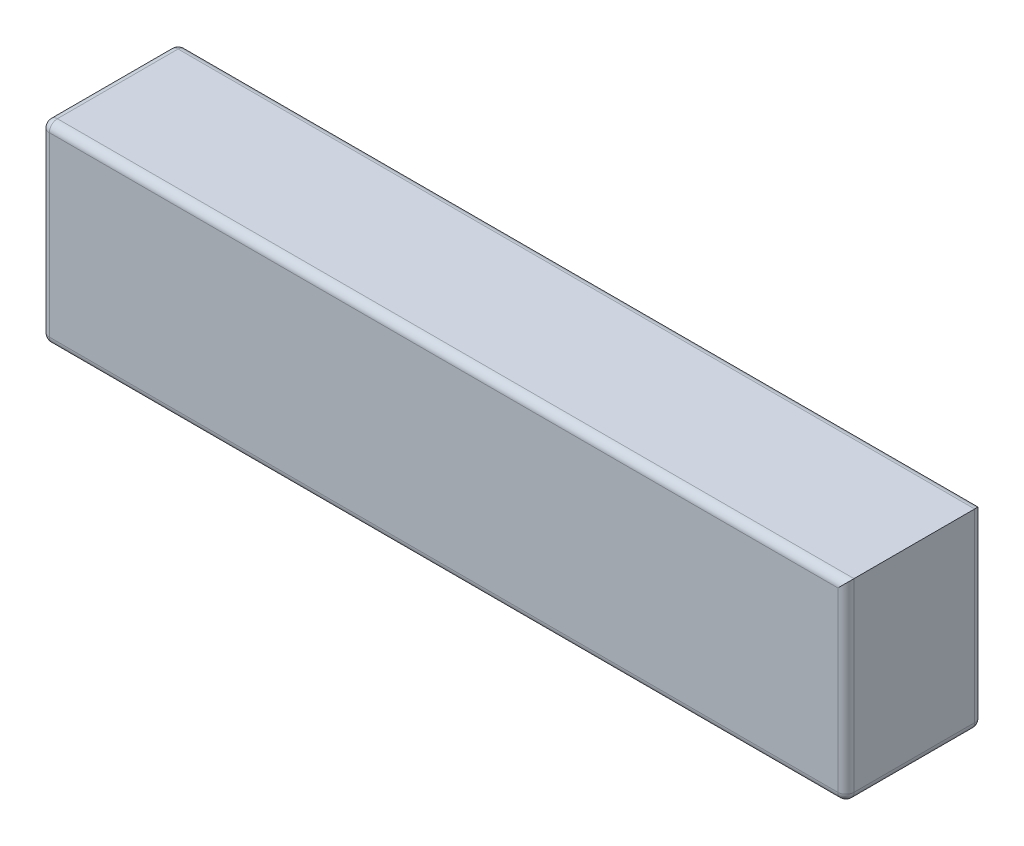
ISO-10303-21;
HEADER;
FILE_DESCRIPTION(('STEP AP214'),'2;1');
FILE_NAME('part.step','',(''),(''),'','','');
FILE_SCHEMA(('AUTOMOTIVE_DESIGN { 1 0 10303 214 1 1 1 1 }'));
ENDSEC;
DATA;
#1=APPLICATION_CONTEXT('core data for automotive mechanical design processes');
#2=APPLICATION_PROTOCOL_DEFINITION('international standard','automotive_design',2000,#1);
#3=PRODUCT_CONTEXT('',#1,'mechanical');
#4=PRODUCT('Part','Part','',(#3));
#5=PRODUCT_RELATED_PRODUCT_CATEGORY('part','',(#4));
#6=PRODUCT_DEFINITION_FORMATION('','',#4);
#7=PRODUCT_DEFINITION_CONTEXT('part definition',#1,'design');
#8=PRODUCT_DEFINITION('design','',#6,#7);
#9=PRODUCT_DEFINITION_SHAPE('','',#8);
#10=(LENGTH_UNIT() NAMED_UNIT(*) SI_UNIT(.MILLI.,.METRE.));
#11=(NAMED_UNIT(*) PLANE_ANGLE_UNIT() SI_UNIT($,.RADIAN.));
#12=(NAMED_UNIT(*) SI_UNIT($,.STERADIAN.) SOLID_ANGLE_UNIT());
#13=UNCERTAINTY_MEASURE_WITH_UNIT(LENGTH_MEASURE(1.E-05),#10,'distance_accuracy_value','');
#14=(GEOMETRIC_REPRESENTATION_CONTEXT(3) GLOBAL_UNCERTAINTY_ASSIGNED_CONTEXT((#13)) GLOBAL_UNIT_ASSIGNED_CONTEXT((#10,
#11,#12)) REPRESENTATION_CONTEXT('',''));
#15=CARTESIAN_POINT('',(0.,0.,0.));
#16=DIRECTION('',(0.,0.,1.));
#17=DIRECTION('',(1.,0.,0.));
#18=AXIS2_PLACEMENT_3D('',#15,#16,#17);
#19=CARTESIAN_POINT('',(12.7,3.048,4.318));
#20=DIRECTION('',(-1.,0.,0.));
#21=DIRECTION('',(0.,-1.,0.));
#22=AXIS2_PLACEMENT_3D('',#19,#20,#21);
#23=PLANE('',#22);
#24=DIRECTION('',(0.,0.,-1.));
#25=VECTOR('',#24,1.);
#26=CARTESIAN_POINT('',(12.7,-2.794,4.318));
#27=LINE('',#26,#25);
#28=CARTESIAN_POINT('',(12.7,-2.794,4.064));
#29=VERTEX_POINT('',#28);
#30=CARTESIAN_POINT('',(12.7,-2.794,0.254));
#31=VERTEX_POINT('',#30);
#32=EDGE_CURVE('E52',#29,#31,#27,.T.);
#33=ORIENTED_EDGE('',*,*,#32,.T.);
#34=DIRECTION('',(0.,1.,0.));
#35=VECTOR('',#34,1.);
#36=CARTESIAN_POINT('',(12.7,3.048,0.254));
#37=LINE('',#36,#35);
#38=CARTESIAN_POINT('',(12.7,3.048,0.254));
#39=VERTEX_POINT('',#38);
#40=EDGE_CURVE('E11',#31,#39,#37,.T.);
#41=ORIENTED_EDGE('',*,*,#40,.T.);
#42=DIRECTION('',(0.,0.,-1.));
#43=VECTOR('',#42,1.);
#44=CARTESIAN_POINT('',(12.7,3.048,4.318));
#45=LINE('',#44,#43);
#46=CARTESIAN_POINT('',(12.7,3.048,4.064));
#47=VERTEX_POINT('',#46);
#48=EDGE_CURVE('E158',#47,#39,#45,.T.);
#49=ORIENTED_EDGE('',*,*,#48,.F.);
#50=DIRECTION('',(0.,1.,0.));
#51=VECTOR('',#50,1.);
#52=CARTESIAN_POINT('',(12.7,-3.048,4.064));
#53=LINE('',#52,#51);
#54=EDGE_CURVE('E63',#47,#29,#53,.F.);
#55=ORIENTED_EDGE('',*,*,#54,.T.);
#56=EDGE_LOOP('',(#33,#41,#49,#55));
#57=FACE_BOUND('',#56,.T.);
#58=ADVANCED_FACE('F42',(#57),#23,.F.);
#59=CARTESIAN_POINT('',(-12.7,3.048,4.318));
#60=DIRECTION('',(0.,-1.,0.));
#61=DIRECTION('',(0.,0.,-1.));
#62=AXIS2_PLACEMENT_3D('',#59,#60,#61);
#63=PLANE('',#62);
#64=ORIENTED_EDGE('',*,*,#48,.T.);
#65=DIRECTION('',(-1.,0.,0.));
#66=VECTOR('',#65,1.);
#67=CARTESIAN_POINT('',(-12.7,3.048,0.254));
#68=LINE('',#67,#66);
#69=CARTESIAN_POINT('',(-12.446,3.048,0.254));
#70=VERTEX_POINT('',#69);
#71=EDGE_CURVE('E175',#39,#70,#68,.T.);
#72=ORIENTED_EDGE('',*,*,#71,.T.);
#73=DIRECTION('',(0.,0.,-1.));
#74=VECTOR('',#73,1.);
#75=CARTESIAN_POINT('',(-12.446,3.048,4.318));
#76=LINE('',#75,#74);
#77=CARTESIAN_POINT('',(-12.446,3.048,4.064));
#78=VERTEX_POINT('',#77);
#79=EDGE_CURVE('E132',#70,#78,#76,.F.);
#80=ORIENTED_EDGE('',*,*,#79,.T.);
#81=DIRECTION('',(-1.,0.,0.));
#82=VECTOR('',#81,1.);
#83=CARTESIAN_POINT('',(12.7,3.048,4.064));
#84=LINE('',#83,#82);
#85=EDGE_CURVE('E165',#78,#47,#84,.F.);
#86=ORIENTED_EDGE('',*,*,#85,.T.);
#87=EDGE_LOOP('',(#64,#72,#80,#86));
#88=FACE_BOUND('',#87,.T.);
#89=ADVANCED_FACE('F314',(#88),#63,.F.);
#90=CARTESIAN_POINT('',(-12.7,3.048,4.318));
#91=DIRECTION('',(1.,0.,0.));
#92=DIRECTION('',(0.,0.,-1.));
#93=AXIS2_PLACEMENT_3D('',#90,#91,#92);
#94=PLANE('',#93);
#95=DIRECTION('',(0.,-1.,0.));
#96=VECTOR('',#95,1.);
#97=CARTESIAN_POINT('',(-12.7,3.048,4.064));
#98=LINE('',#97,#96);
#99=CARTESIAN_POINT('',(-12.7,-2.794,4.064));
#100=VERTEX_POINT('',#99);
#101=CARTESIAN_POINT('',(-12.7,2.794,4.064));
#102=VERTEX_POINT('',#101);
#103=EDGE_CURVE('E162',#100,#102,#98,.F.);
#104=ORIENTED_EDGE('',*,*,#103,.T.);
#105=DIRECTION('',(0.,0.,-1.));
#106=VECTOR('',#105,1.);
#107=CARTESIAN_POINT('',(-12.7,2.794,4.318));
#108=LINE('',#107,#106);
#109=CARTESIAN_POINT('',(-12.7,2.794,0.254));
#110=VERTEX_POINT('',#109);
#111=EDGE_CURVE('E130',#102,#110,#108,.T.);
#112=ORIENTED_EDGE('',*,*,#111,.T.);
#113=DIRECTION('',(0.,-1.,0.));
#114=VECTOR('',#113,1.);
#115=CARTESIAN_POINT('',(-12.7,3.048,0.254));
#116=LINE('',#115,#114);
#117=CARTESIAN_POINT('',(-12.7,-2.794,0.254));
#118=VERTEX_POINT('',#117);
#119=EDGE_CURVE('E150',#110,#118,#116,.T.);
#120=ORIENTED_EDGE('',*,*,#119,.T.);
#121=DIRECTION('',(0.,0.,-1.));
#122=VECTOR('',#121,1.);
#123=CARTESIAN_POINT('',(-12.7,-2.794,4.318));
#124=LINE('',#123,#122);
#125=EDGE_CURVE('E157',#118,#100,#124,.F.);
#126=ORIENTED_EDGE('',*,*,#125,.T.);
#127=EDGE_LOOP('',(#104,#112,#120,#126));
#128=FACE_BOUND('',#127,.T.);
#129=ADVANCED_FACE('F160',(#128),#94,.F.);
#130=CARTESIAN_POINT('',(-12.7,-3.048,4.318));
#131=DIRECTION('',(0.,1.,0.));
#132=DIRECTION('',(0.,0.,1.));
#133=AXIS2_PLACEMENT_3D('',#130,#131,#132);
#134=PLANE('',#133);
#135=DIRECTION('',(1.,0.,0.));
#136=VECTOR('',#135,1.);
#137=CARTESIAN_POINT('',(-12.7,-3.048,4.064));
#138=LINE('',#137,#136);
#139=CARTESIAN_POINT('',(12.446,-3.048,4.064));
#140=VERTEX_POINT('',#139);
#141=CARTESIAN_POINT('',(-12.446,-3.048,4.064));
#142=VERTEX_POINT('',#141);
#143=EDGE_CURVE('E191',#140,#142,#138,.F.);
#144=ORIENTED_EDGE('',*,*,#143,.T.);
#145=DIRECTION('',(0.,0.,-1.));
#146=VECTOR('',#145,1.);
#147=CARTESIAN_POINT('',(-12.446,-3.048,4.318));
#148=LINE('',#147,#146);
#149=CARTESIAN_POINT('',(-12.446,-3.048,0.254));
#150=VERTEX_POINT('',#149);
#151=EDGE_CURVE('E200',#142,#150,#148,.T.);
#152=ORIENTED_EDGE('',*,*,#151,.T.);
#153=DIRECTION('',(1.,0.,0.));
#154=VECTOR('',#153,1.);
#155=CARTESIAN_POINT('',(-12.7,-3.048,0.254));
#156=LINE('',#155,#154);
#157=CARTESIAN_POINT('',(12.446,-3.048,0.254));
#158=VERTEX_POINT('',#157);
#159=EDGE_CURVE('E197',#150,#158,#156,.T.);
#160=ORIENTED_EDGE('',*,*,#159,.T.);
#161=DIRECTION('',(0.,0.,-1.));
#162=VECTOR('',#161,1.);
#163=CARTESIAN_POINT('',(12.446,-3.048,4.318));
#164=LINE('',#163,#162);
#165=EDGE_CURVE('E194',#158,#140,#164,.F.);
#166=ORIENTED_EDGE('',*,*,#165,.T.);
#167=EDGE_LOOP('',(#144,#152,#160,#166));
#168=FACE_BOUND('',#167,.T.);
#169=ADVANCED_FACE('F522',(#168),#134,.F.);
#170=CARTESIAN_POINT('',(0.,0.,4.318));
#171=DIRECTION('',(0.,0.,1.));
#172=DIRECTION('',(1.,0.,0.));
#173=AXIS2_PLACEMENT_3D('',#170,#171,#172);
#174=PLANE('',#173);
#175=DIRECTION('',(0.,-1.,0.));
#176=VECTOR('',#175,1.);
#177=CARTESIAN_POINT('',(-12.446,-3.048,4.318));
#178=LINE('',#177,#176);
#179=CARTESIAN_POINT('',(-12.446,2.794,4.318));
#180=VERTEX_POINT('',#179);
#181=CARTESIAN_POINT('',(-12.446,-2.794,4.318));
#182=VERTEX_POINT('',#181);
#183=EDGE_CURVE('E184',#180,#182,#178,.T.);
#184=ORIENTED_EDGE('',*,*,#183,.T.);
#185=DIRECTION('',(1.,0.,0.));
#186=VECTOR('',#185,1.);
#187=CARTESIAN_POINT('',(12.7,-2.794,4.318));
#188=LINE('',#187,#186);
#189=CARTESIAN_POINT('',(12.446,-2.794,4.318));
#190=VERTEX_POINT('',#189);
#191=EDGE_CURVE('E188',#182,#190,#188,.T.);
#192=ORIENTED_EDGE('',*,*,#191,.T.);
#193=DIRECTION('',(0.,1.,0.));
#194=VECTOR('',#193,1.);
#195=CARTESIAN_POINT('',(12.446,3.048,4.318));
#196=LINE('',#195,#194);
#197=CARTESIAN_POINT('',(12.446,2.794,4.318));
#198=VERTEX_POINT('',#197);
#199=EDGE_CURVE('E181',#190,#198,#196,.T.);
#200=ORIENTED_EDGE('',*,*,#199,.T.);
#201=DIRECTION('',(-1.,0.,0.));
#202=VECTOR('',#201,1.);
#203=CARTESIAN_POINT('',(-12.7,2.794,4.318));
#204=LINE('',#203,#202);
#205=EDGE_CURVE('E178',#198,#180,#204,.T.);
#206=ORIENTED_EDGE('',*,*,#205,.T.);
#207=EDGE_LOOP('',(#184,#192,#200,#206));
#208=FACE_BOUND('',#207,.T.);
#209=ADVANCED_FACE('F512',(#208),#174,.T.);
#210=CARTESIAN_POINT('',(0.,0.,0.));
#211=DIRECTION('',(0.,0.,1.));
#212=DIRECTION('',(1.,0.,0.));
#213=AXIS2_PLACEMENT_3D('',#210,#211,#212);
#214=PLANE('',#213);
#215=DIRECTION('',(1.,0.,0.));
#216=VECTOR('',#215,1.);
#217=CARTESIAN_POINT('',(0.,-2.794,0.));
#218=LINE('',#217,#216);
#219=CARTESIAN_POINT('',(12.446,-2.794,0.));
#220=VERTEX_POINT('',#219);
#221=CARTESIAN_POINT('',(-12.446,-2.794,0.));
#222=VERTEX_POINT('',#221);
#223=EDGE_CURVE('E210',#220,#222,#218,.F.);
#224=ORIENTED_EDGE('',*,*,#223,.T.);
#225=DIRECTION('',(0.,-1.,0.));
#226=VECTOR('',#225,1.);
#227=CARTESIAN_POINT('',(-12.446,0.,0.));
#228=LINE('',#227,#226);
#229=CARTESIAN_POINT('',(-12.446,2.794,0.));
#230=VERTEX_POINT('',#229);
#231=EDGE_CURVE('E213',#222,#230,#228,.F.);
#232=ORIENTED_EDGE('',*,*,#231,.T.);
#233=DIRECTION('',(-1.,0.,0.));
#234=VECTOR('',#233,1.);
#235=CARTESIAN_POINT('',(0.,2.794,0.));
#236=LINE('',#235,#234);
#237=CARTESIAN_POINT('',(12.446,2.794,0.));
#238=VERTEX_POINT('',#237);
#239=EDGE_CURVE('E204',#230,#238,#236,.F.);
#240=ORIENTED_EDGE('',*,*,#239,.T.);
#241=DIRECTION('',(0.,1.,0.));
#242=VECTOR('',#241,1.);
#243=CARTESIAN_POINT('',(12.446,0.,0.));
#244=LINE('',#243,#242);
#245=EDGE_CURVE('E207',#238,#220,#244,.F.);
#246=ORIENTED_EDGE('',*,*,#245,.T.);
#247=EDGE_LOOP('',(#224,#232,#240,#246));
#248=FACE_BOUND('',#247,.T.);
#249=ADVANCED_FACE('F320',(#248),#214,.F.);
#250=CARTESIAN_POINT('',(12.446,-2.794,4.318));
#251=DIRECTION('',(0.,0.,-1.));
#252=DIRECTION('',(-1.,0.,0.));
#253=AXIS2_PLACEMENT_3D('',#250,#251,#252);
#254=CYLINDRICAL_SURFACE('',#253,0.254);
#255=CARTESIAN_POINT('',(12.446,-2.794,4.064));
#256=DIRECTION('',(0.,0.,1.));
#257=DIRECTION('',(1.,0.,0.));
#258=AXIS2_PLACEMENT_3D('',#255,#256,#257);
#259=CIRCLE('',#258,0.254);
#260=EDGE_CURVE('E46',#140,#29,#259,.T.);
#261=ORIENTED_EDGE('',*,*,#260,.F.);
#262=ORIENTED_EDGE('',*,*,#165,.F.);
#263=CARTESIAN_POINT('',(12.446,-2.794,0.254));
#264=DIRECTION('',(0.,0.,-1.));
#265=DIRECTION('',(-1.,0.,0.));
#266=AXIS2_PLACEMENT_3D('',#263,#264,#265);
#267=CIRCLE('',#266,0.254);
#268=EDGE_CURVE('E268',#31,#158,#267,.T.);
#269=ORIENTED_EDGE('',*,*,#268,.F.);
#270=ORIENTED_EDGE('',*,*,#32,.F.);
#271=EDGE_LOOP('',(#261,#262,#269,#270));
#272=FACE_BOUND('',#271,.T.);
#273=ADVANCED_FACE('F44',(#272),#254,.T.);
#274=CARTESIAN_POINT('',(12.446,-2.794,4.064));
#275=DIRECTION('',(0.,-1.,0.));
#276=DIRECTION('',(0.,0.,-1.));
#277=AXIS2_PLACEMENT_3D('',#274,#275,#276);
#278=SPHERICAL_SURFACE('',#277,0.254);
#279=CARTESIAN_POINT('',(12.446,-2.794,4.064));
#280=DIRECTION('',(0.,-1.,0.));
#281=DIRECTION('',(0.,0.,-1.));
#282=AXIS2_PLACEMENT_3D('',#279,#280,#281);
#283=CIRCLE('',#282,0.254);
#284=EDGE_CURVE('E264',#190,#29,#283,.F.);
#285=ORIENTED_EDGE('',*,*,#284,.F.);
#286=CARTESIAN_POINT('',(12.446,-2.794,4.064));
#287=DIRECTION('',(1.,0.,0.));
#288=DIRECTION('',(0.,0.,-1.));
#289=AXIS2_PLACEMENT_3D('',#286,#287,#288);
#290=CIRCLE('',#289,0.254);
#291=EDGE_CURVE('E275',#140,#190,#290,.F.);
#292=ORIENTED_EDGE('',*,*,#291,.F.);
#293=ORIENTED_EDGE('',*,*,#260,.T.);
#294=EDGE_LOOP('',(#285,#292,#293));
#295=FACE_BOUND('',#294,.T.);
#296=ADVANCED_FACE('F485',(#295),#278,.T.);
#297=CARTESIAN_POINT('',(0.,-2.794,4.064));
#298=DIRECTION('',(-1.,0.,0.));
#299=DIRECTION('',(0.,0.,1.));
#300=AXIS2_PLACEMENT_3D('',#297,#298,#299);
#301=CYLINDRICAL_SURFACE('',#300,0.254);
#302=ORIENTED_EDGE('',*,*,#291,.T.);
#303=ORIENTED_EDGE('',*,*,#191,.F.);
#304=CARTESIAN_POINT('',(-12.446,-2.794,4.064));
#305=DIRECTION('',(-1.,0.,0.));
#306=DIRECTION('',(0.,0.,1.));
#307=AXIS2_PLACEMENT_3D('',#304,#305,#306);
#308=CIRCLE('',#307,0.254);
#309=EDGE_CURVE('E260',#142,#182,#308,.T.);
#310=ORIENTED_EDGE('',*,*,#309,.F.);
#311=ORIENTED_EDGE('',*,*,#143,.F.);
#312=EDGE_LOOP('',(#302,#303,#310,#311));
#313=FACE_BOUND('',#312,.T.);
#314=ADVANCED_FACE('F475',(#313),#301,.T.);
#315=CARTESIAN_POINT('',(-12.446,-2.794,4.318));
#316=DIRECTION('',(0.,0.,-1.));
#317=DIRECTION('',(-1.,0.,0.));
#318=AXIS2_PLACEMENT_3D('',#315,#316,#317);
#319=CYLINDRICAL_SURFACE('',#318,0.254);
#320=CARTESIAN_POINT('',(-12.446,-2.794,0.254));
#321=DIRECTION('',(0.,0.,-1.));
#322=DIRECTION('',(-1.,0.,0.));
#323=AXIS2_PLACEMENT_3D('',#320,#321,#322);
#324=CIRCLE('',#323,0.254);
#325=EDGE_CURVE('E252',#150,#118,#324,.T.);
#326=ORIENTED_EDGE('',*,*,#325,.F.);
#327=ORIENTED_EDGE('',*,*,#151,.F.);
#328=CARTESIAN_POINT('',(-12.446,-2.794,4.064));
#329=DIRECTION('',(0.,0.,1.));
#330=DIRECTION('',(1.,0.,0.));
#331=AXIS2_PLACEMENT_3D('',#328,#329,#330);
#332=CIRCLE('',#331,0.254);
#333=EDGE_CURVE('E256',#100,#142,#332,.T.);
#334=ORIENTED_EDGE('',*,*,#333,.F.);
#335=ORIENTED_EDGE('',*,*,#125,.F.);
#336=EDGE_LOOP('',(#326,#327,#334,#335));
#337=FACE_BOUND('',#336,.T.);
#338=ADVANCED_FACE('F298',(#337),#319,.T.);
#339=CARTESIAN_POINT('',(-12.7,-2.794,0.254));
#340=DIRECTION('',(1.,0.,0.));
#341=DIRECTION('',(0.,0.,-1.));
#342=AXIS2_PLACEMENT_3D('',#339,#340,#341);
#343=CYLINDRICAL_SURFACE('',#342,0.254);
#344=CARTESIAN_POINT('',(12.446,-2.794,0.254));
#345=DIRECTION('',(1.,0.,0.));
#346=DIRECTION('',(0.,0.,-1.));
#347=AXIS2_PLACEMENT_3D('',#344,#345,#346);
#348=CIRCLE('',#347,0.254);
#349=EDGE_CURVE('E272',#158,#220,#348,.T.);
#350=ORIENTED_EDGE('',*,*,#349,.F.);
#351=ORIENTED_EDGE('',*,*,#159,.F.);
#352=CARTESIAN_POINT('',(-12.446,-2.794,0.254));
#353=DIRECTION('',(-1.,0.,0.));
#354=DIRECTION('',(0.,0.,1.));
#355=AXIS2_PLACEMENT_3D('',#352,#353,#354);
#356=CIRCLE('',#355,0.254);
#357=EDGE_CURVE('E249',#222,#150,#356,.T.);
#358=ORIENTED_EDGE('',*,*,#357,.F.);
#359=ORIENTED_EDGE('',*,*,#223,.F.);
#360=EDGE_LOOP('',(#350,#351,#358,#359));
#361=FACE_BOUND('',#360,.T.);
#362=ADVANCED_FACE('F326',(#361),#343,.T.);
#363=CARTESIAN_POINT('',(12.446,-2.794,0.254));
#364=DIRECTION('',(0.,-1.,0.));
#365=DIRECTION('',(0.,0.,-1.));
#366=AXIS2_PLACEMENT_3D('',#363,#364,#365);
#367=SPHERICAL_SURFACE('',#366,0.254);
#368=ORIENTED_EDGE('',*,*,#268,.T.);
#369=ORIENTED_EDGE('',*,*,#349,.T.);
#370=CARTESIAN_POINT('',(12.446,-2.794,0.254));
#371=DIRECTION('',(0.,-1.,0.));
#372=DIRECTION('',(0.,0.,-1.));
#373=AXIS2_PLACEMENT_3D('',#370,#371,#372);
#374=CIRCLE('',#373,0.254);
#375=EDGE_CURVE('E245',#31,#220,#374,.F.);
#376=ORIENTED_EDGE('',*,*,#375,.F.);
#377=EDGE_LOOP('',(#368,#369,#376));
#378=FACE_BOUND('',#377,.T.);
#379=ADVANCED_FACE('F445',(#378),#367,.T.);
#380=CARTESIAN_POINT('',(12.446,0.,4.064));
#381=DIRECTION('',(0.,-1.,0.));
#382=DIRECTION('',(1.,0.,0.));
#383=AXIS2_PLACEMENT_3D('',#380,#381,#382);
#384=CYLINDRICAL_SURFACE('',#383,0.254);
#385=ORIENTED_EDGE('',*,*,#284,.T.);
#386=ORIENTED_EDGE('',*,*,#54,.F.);
#387=CARTESIAN_POINT('',(12.446,2.794,4.064));
#388=DIRECTION('',(0.707106781186548,-0.707106781186547,0.));
#389=DIRECTION('',(0.707106781186547,0.707106781186548,0.));
#390=AXIS2_PLACEMENT_3D('',#387,#388,#389);
#391=ELLIPSE('',#390,0.359210244842766,0.254);
#392=EDGE_CURVE('E241',#198,#47,#391,.F.);
#393=ORIENTED_EDGE('',*,*,#392,.F.);
#394=ORIENTED_EDGE('',*,*,#199,.F.);
#395=EDGE_LOOP('',(#385,#386,#393,#394));
#396=FACE_BOUND('',#395,.T.);
#397=ADVANCED_FACE('F338',(#396),#384,.T.);
#398=CARTESIAN_POINT('',(-12.446,-2.794,4.064));
#399=DIRECTION('',(0.,-1.,0.));
#400=DIRECTION('',(0.,0.,-1.));
#401=AXIS2_PLACEMENT_3D('',#398,#399,#400);
#402=SPHERICAL_SURFACE('',#401,0.254);
#403=ORIENTED_EDGE('',*,*,#333,.T.);
#404=ORIENTED_EDGE('',*,*,#309,.T.);
#405=CARTESIAN_POINT('',(-12.446,-2.794,4.064));
#406=DIRECTION('',(0.,-1.,0.));
#407=DIRECTION('',(0.,0.,-1.));
#408=AXIS2_PLACEMENT_3D('',#405,#406,#407);
#409=CIRCLE('',#408,0.254);
#410=EDGE_CURVE('E238',#100,#182,#409,.F.);
#411=ORIENTED_EDGE('',*,*,#410,.F.);
#412=EDGE_LOOP('',(#403,#404,#411));
#413=FACE_BOUND('',#412,.T.);
#414=ADVANCED_FACE('F301',(#413),#402,.T.);
#415=CARTESIAN_POINT('',(-12.446,-2.794,0.254));
#416=DIRECTION('',(0.,-1.,0.));
#417=DIRECTION('',(0.,0.,-1.));
#418=AXIS2_PLACEMENT_3D('',#415,#416,#417);
#419=SPHERICAL_SURFACE('',#418,0.254);
#420=ORIENTED_EDGE('',*,*,#357,.T.);
#421=ORIENTED_EDGE('',*,*,#325,.T.);
#422=CARTESIAN_POINT('',(-12.446,-2.794,0.254));
#423=DIRECTION('',(0.,-1.,0.));
#424=DIRECTION('',(0.,0.,-1.));
#425=AXIS2_PLACEMENT_3D('',#422,#423,#424);
#426=CIRCLE('',#425,0.254);
#427=EDGE_CURVE('E153',#222,#118,#426,.F.);
#428=ORIENTED_EDGE('',*,*,#427,.F.);
#429=EDGE_LOOP('',(#420,#421,#428));
#430=FACE_BOUND('',#429,.T.);
#431=ADVANCED_FACE('F328',(#430),#419,.T.);
#432=CARTESIAN_POINT('',(12.446,3.048,0.254));
#433=DIRECTION('',(0.,1.,0.));
#434=DIRECTION('',(-1.,0.,0.));
#435=AXIS2_PLACEMENT_3D('',#432,#433,#434);
#436=CYLINDRICAL_SURFACE('',#435,0.254);
#437=ORIENTED_EDGE('',*,*,#375,.T.);
#438=ORIENTED_EDGE('',*,*,#245,.F.);
#439=CARTESIAN_POINT('',(12.446,2.794,0.254));
#440=DIRECTION('',(-0.707106781186548,0.707106781186547,0.));
#441=DIRECTION('',(-0.707106781186547,-0.707106781186548,0.));
#442=AXIS2_PLACEMENT_3D('',#439,#440,#441);
#443=ELLIPSE('',#442,0.359210244842766,0.254);
#444=EDGE_CURVE('E232',#39,#238,#443,.T.);
#445=ORIENTED_EDGE('',*,*,#444,.F.);
#446=ORIENTED_EDGE('',*,*,#40,.F.);
#447=EDGE_LOOP('',(#437,#438,#445,#446));
#448=FACE_BOUND('',#447,.T.);
#449=ADVANCED_FACE('F330',(#448),#436,.T.);
#450=CARTESIAN_POINT('',(0.,2.794,4.064));
#451=DIRECTION('',(1.,0.,0.));
#452=DIRECTION('',(0.,0.,-1.));
#453=AXIS2_PLACEMENT_3D('',#450,#451,#452);
#454=CYLINDRICAL_SURFACE('',#453,0.254);
#455=ORIENTED_EDGE('',*,*,#392,.T.);
#456=ORIENTED_EDGE('',*,*,#85,.F.);
#457=CARTESIAN_POINT('',(-12.446,2.794,4.064));
#458=DIRECTION('',(-1.,0.,0.));
#459=DIRECTION('',(0.,0.,1.));
#460=AXIS2_PLACEMENT_3D('',#457,#458,#459);
#461=CIRCLE('',#460,0.254);
#462=EDGE_CURVE('E228',#180,#78,#461,.T.);
#463=ORIENTED_EDGE('',*,*,#462,.F.);
#464=ORIENTED_EDGE('',*,*,#205,.F.);
#465=EDGE_LOOP('',(#455,#456,#463,#464));
#466=FACE_BOUND('',#465,.T.);
#467=ADVANCED_FACE('F312',(#466),#454,.T.);
#468=CARTESIAN_POINT('',(-12.446,0.,4.064));
#469=DIRECTION('',(0.,1.,0.));
#470=DIRECTION('',(0.,0.,1.));
#471=AXIS2_PLACEMENT_3D('',#468,#469,#470);
#472=CYLINDRICAL_SURFACE('',#471,0.254);
#473=ORIENTED_EDGE('',*,*,#410,.T.);
#474=ORIENTED_EDGE('',*,*,#183,.F.);
#475=CARTESIAN_POINT('',(-12.446,2.794,4.064));
#476=DIRECTION('',(0.,1.,0.));
#477=DIRECTION('',(0.,0.,1.));
#478=AXIS2_PLACEMENT_3D('',#475,#476,#477);
#479=CIRCLE('',#478,0.254);
#480=EDGE_CURVE('E147',#102,#180,#479,.T.);
#481=ORIENTED_EDGE('',*,*,#480,.F.);
#482=ORIENTED_EDGE('',*,*,#103,.F.);
#483=EDGE_LOOP('',(#473,#474,#481,#482));
#484=FACE_BOUND('',#483,.T.);
#485=ADVANCED_FACE('F304',(#484),#472,.T.);
#486=CARTESIAN_POINT('',(-12.446,3.048,0.254));
#487=DIRECTION('',(0.,-1.,0.));
#488=DIRECTION('',(0.,0.,-1.));
#489=AXIS2_PLACEMENT_3D('',#486,#487,#488);
#490=CYLINDRICAL_SURFACE('',#489,0.254);
#491=ORIENTED_EDGE('',*,*,#427,.T.);
#492=ORIENTED_EDGE('',*,*,#119,.F.);
#493=CARTESIAN_POINT('',(-12.446,2.794,0.254));
#494=DIRECTION('',(0.,1.,0.));
#495=DIRECTION('',(0.,0.,1.));
#496=AXIS2_PLACEMENT_3D('',#493,#494,#495);
#497=CIRCLE('',#496,0.254);
#498=EDGE_CURVE('E138',#230,#110,#497,.T.);
#499=ORIENTED_EDGE('',*,*,#498,.F.);
#500=ORIENTED_EDGE('',*,*,#231,.F.);
#501=EDGE_LOOP('',(#491,#492,#499,#500));
#502=FACE_BOUND('',#501,.T.);
#503=ADVANCED_FACE('F151',(#502),#490,.T.);
#504=CARTESIAN_POINT('',(-12.7,2.794,0.254));
#505=DIRECTION('',(-1.,0.,0.));
#506=DIRECTION('',(0.,0.,1.));
#507=AXIS2_PLACEMENT_3D('',#504,#505,#506);
#508=CYLINDRICAL_SURFACE('',#507,0.254);
#509=ORIENTED_EDGE('',*,*,#444,.T.);
#510=ORIENTED_EDGE('',*,*,#239,.F.);
#511=CARTESIAN_POINT('',(-12.446,2.794,0.254));
#512=DIRECTION('',(-1.,0.,0.));
#513=DIRECTION('',(0.,0.,1.));
#514=AXIS2_PLACEMENT_3D('',#511,#512,#513);
#515=CIRCLE('',#514,0.254);
#516=EDGE_CURVE('E142',#70,#230,#515,.T.);
#517=ORIENTED_EDGE('',*,*,#516,.F.);
#518=ORIENTED_EDGE('',*,*,#71,.F.);
#519=EDGE_LOOP('',(#509,#510,#517,#518));
#520=FACE_BOUND('',#519,.T.);
#521=ADVANCED_FACE('F317',(#520),#508,.T.);
#522=CARTESIAN_POINT('',(-12.446,2.794,4.064));
#523=DIRECTION('',(0.,0.,1.));
#524=DIRECTION('',(1.,0.,0.));
#525=AXIS2_PLACEMENT_3D('',#522,#523,#524);
#526=SPHERICAL_SURFACE('',#525,0.254);
#527=ORIENTED_EDGE('',*,*,#480,.T.);
#528=ORIENTED_EDGE('',*,*,#462,.T.);
#529=CARTESIAN_POINT('',(-12.446,2.794,4.064));
#530=DIRECTION('',(0.,0.,1.));
#531=DIRECTION('',(1.,0.,0.));
#532=AXIS2_PLACEMENT_3D('',#529,#530,#531);
#533=CIRCLE('',#532,0.254);
#534=EDGE_CURVE('E135',#102,#78,#533,.F.);
#535=ORIENTED_EDGE('',*,*,#534,.F.);
#536=EDGE_LOOP('',(#527,#528,#535));
#537=FACE_BOUND('',#536,.T.);
#538=ADVANCED_FACE('F308',(#537),#526,.T.);
#539=CARTESIAN_POINT('',(-12.446,2.794,0.254));
#540=DIRECTION('',(0.,0.,-1.));
#541=DIRECTION('',(-1.,0.,0.));
#542=AXIS2_PLACEMENT_3D('',#539,#540,#541);
#543=SPHERICAL_SURFACE('',#542,0.254);
#544=ORIENTED_EDGE('',*,*,#516,.T.);
#545=ORIENTED_EDGE('',*,*,#498,.T.);
#546=CARTESIAN_POINT('',(-12.446,2.794,0.254));
#547=DIRECTION('',(0.,0.,-1.));
#548=DIRECTION('',(-1.,0.,0.));
#549=AXIS2_PLACEMENT_3D('',#546,#547,#548);
#550=CIRCLE('',#549,0.254);
#551=EDGE_CURVE('E126',#70,#110,#550,.F.);
#552=ORIENTED_EDGE('',*,*,#551,.F.);
#553=EDGE_LOOP('',(#544,#545,#552));
#554=FACE_BOUND('',#553,.T.);
#555=ADVANCED_FACE('F140',(#554),#543,.T.);
#556=CARTESIAN_POINT('',(-12.446,2.794,4.318));
#557=DIRECTION('',(0.,0.,-1.));
#558=DIRECTION('',(-1.,0.,0.));
#559=AXIS2_PLACEMENT_3D('',#556,#557,#558);
#560=CYLINDRICAL_SURFACE('',#559,0.254);
#561=ORIENTED_EDGE('',*,*,#534,.T.);
#562=ORIENTED_EDGE('',*,*,#79,.F.);
#563=ORIENTED_EDGE('',*,*,#551,.T.);
#564=ORIENTED_EDGE('',*,*,#111,.F.);
#565=EDGE_LOOP('',(#561,#562,#563,#564));
#566=FACE_BOUND('',#565,.T.);
#567=ADVANCED_FACE('F128',(#566),#560,.T.);
#568=CLOSED_SHELL('',(#58,#89,#129,#169,#209,#249,#273,#296,#314,#338,#362,#379,#397,#414,#431,
#449,#467,#485,#503,#521,#538,#555,#567));
#569=MANIFOLD_SOLID_BREP('B2',#568);
#570=ADVANCED_BREP_SHAPE_REPRESENTATION('',(#18,#569),#14);
#571=SHAPE_DEFINITION_REPRESENTATION(#9,#570);
ENDSEC;
END-ISO-10303-21;
